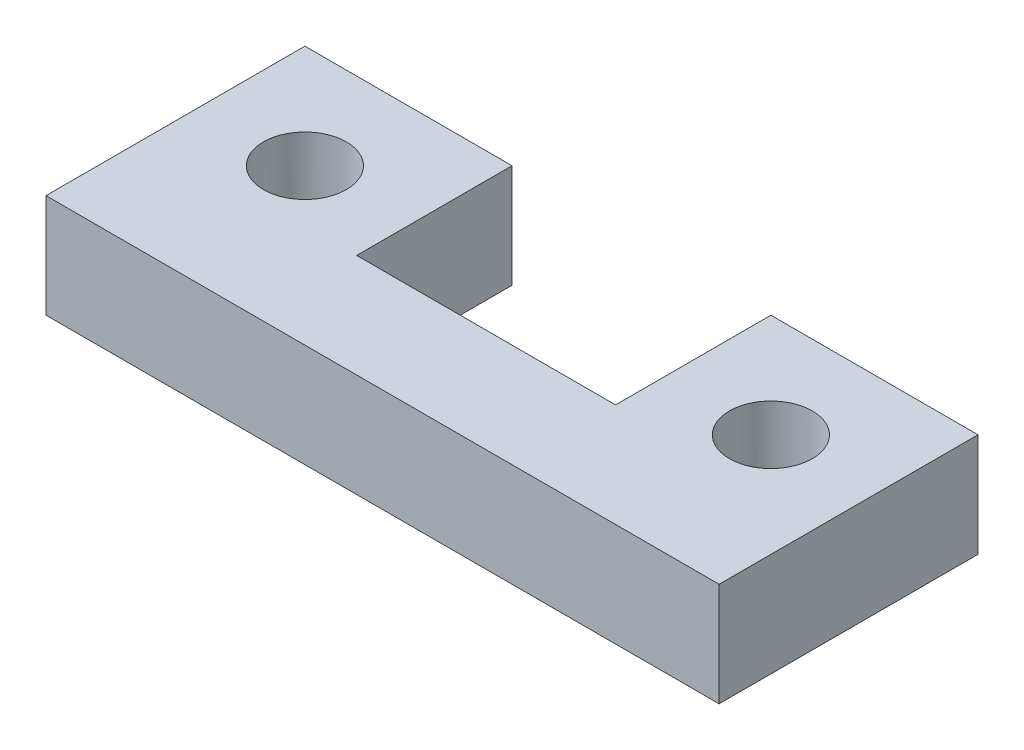
ISO-10303-21;
HEADER;
FILE_DESCRIPTION(('STEP AP214'),'2;1');
FILE_NAME('part.step','',(''),(''),'','','');
FILE_SCHEMA(('AUTOMOTIVE_DESIGN { 1 0 10303 214 1 1 1 1 }'));
ENDSEC;
DATA;
#1=APPLICATION_CONTEXT('core data for automotive mechanical design processes');
#2=APPLICATION_PROTOCOL_DEFINITION('international standard','automotive_design',2000,#1);
#3=PRODUCT_CONTEXT('',#1,'mechanical');
#4=PRODUCT('Part','Part','',(#3));
#5=PRODUCT_RELATED_PRODUCT_CATEGORY('part','',(#4));
#6=PRODUCT_DEFINITION_FORMATION('','',#4);
#7=PRODUCT_DEFINITION_CONTEXT('part definition',#1,'design');
#8=PRODUCT_DEFINITION('design','',#6,#7);
#9=PRODUCT_DEFINITION_SHAPE('','',#8);
#10=(LENGTH_UNIT() NAMED_UNIT(*) SI_UNIT(.MILLI.,.METRE.));
#11=(NAMED_UNIT(*) PLANE_ANGLE_UNIT() SI_UNIT($,.RADIAN.));
#12=(NAMED_UNIT(*) SI_UNIT($,.STERADIAN.) SOLID_ANGLE_UNIT());
#13=UNCERTAINTY_MEASURE_WITH_UNIT(LENGTH_MEASURE(1.E-05),#10,'distance_accuracy_value','');
#14=(GEOMETRIC_REPRESENTATION_CONTEXT(3) GLOBAL_UNCERTAINTY_ASSIGNED_CONTEXT((#13)) GLOBAL_UNIT_ASSIGNED_CONTEXT((#10,
#11,#12)) REPRESENTATION_CONTEXT('',''));
#15=CARTESIAN_POINT('',(0.,0.,0.));
#16=DIRECTION('',(0.,0.,1.));
#17=DIRECTION('',(1.,0.,0.));
#18=AXIS2_PLACEMENT_3D('',#15,#16,#17);
#19=CARTESIAN_POINT('',(-12.5,5.,-9.99999999999999));
#20=DIRECTION('',(0.,0.,1.));
#21=DIRECTION('',(1.,0.,0.));
#22=AXIS2_PLACEMENT_3D('',#19,#20,#21);
#23=PLANE('',#22);
#24=DIRECTION('',(-1.,0.,0.));
#25=VECTOR('',#24,1.);
#26=CARTESIAN_POINT('',(-12.5,-5.,-9.99999999999999));
#27=LINE('',#26,#25);
#28=CARTESIAN_POINT('',(12.5,-5.,-9.99999999999999));
#29=VERTEX_POINT('',#28);
#30=CARTESIAN_POINT('',(-12.5,-5.,-9.99999999999999));
#31=VERTEX_POINT('',#30);
#32=EDGE_CURVE('E140',#29,#31,#27,.T.);
#33=ORIENTED_EDGE('',*,*,#32,.T.);
#34=DIRECTION('',(0.,-1.,0.));
#35=VECTOR('',#34,1.);
#36=CARTESIAN_POINT('',(-12.5,5.,-9.99999999999999));
#37=LINE('',#36,#35);
#38=CARTESIAN_POINT('',(-12.5,5.,-9.99999999999999));
#39=VERTEX_POINT('',#38);
#40=EDGE_CURVE('E11',#39,#31,#37,.T.);
#41=ORIENTED_EDGE('',*,*,#40,.F.);
#42=DIRECTION('',(-1.,0.,0.));
#43=VECTOR('',#42,1.);
#44=CARTESIAN_POINT('',(-12.5,5.,-9.99999999999999));
#45=LINE('',#44,#43);
#46=CARTESIAN_POINT('',(12.5,5.,-9.99999999999999));
#47=VERTEX_POINT('',#46);
#48=EDGE_CURVE('E163',#47,#39,#45,.T.);
#49=ORIENTED_EDGE('',*,*,#48,.F.);
#50=DIRECTION('',(0.,-1.,0.));
#51=VECTOR('',#50,1.);
#52=CARTESIAN_POINT('',(12.5,5.,-9.99999999999999));
#53=LINE('',#52,#51);
#54=EDGE_CURVE('E136',#47,#29,#53,.T.);
#55=ORIENTED_EDGE('',*,*,#54,.T.);
#56=EDGE_LOOP('',(#33,#41,#49,#55));
#57=FACE_BOUND('',#56,.T.);
#58=ADVANCED_FACE('F39',(#57),#23,.F.);
#59=CARTESIAN_POINT('',(-12.5,5.,-25.));
#60=DIRECTION('',(-1.,0.,0.));
#61=DIRECTION('',(0.,0.,1.));
#62=AXIS2_PLACEMENT_3D('',#59,#60,#61);
#63=PLANE('',#62);
#64=DIRECTION('',(0.,0.,-1.));
#65=VECTOR('',#64,1.);
#66=CARTESIAN_POINT('',(-12.5,-5.,-25.));
#67=LINE('',#66,#65);
#68=CARTESIAN_POINT('',(-12.5,-5.,-25.));
#69=VERTEX_POINT('',#68);
#70=EDGE_CURVE('E144',#31,#69,#67,.T.);
#71=ORIENTED_EDGE('',*,*,#70,.T.);
#72=DIRECTION('',(0.,-1.,0.));
#73=VECTOR('',#72,1.);
#74=CARTESIAN_POINT('',(-12.5,5.,-25.));
#75=LINE('',#74,#73);
#76=CARTESIAN_POINT('',(-12.5,5.,-25.));
#77=VERTEX_POINT('',#76);
#78=EDGE_CURVE('E48',#77,#69,#75,.T.);
#79=ORIENTED_EDGE('',*,*,#78,.F.);
#80=DIRECTION('',(0.,0.,-1.));
#81=VECTOR('',#80,1.);
#82=CARTESIAN_POINT('',(-12.5,5.,-25.));
#83=LINE('',#82,#81);
#84=EDGE_CURVE('E99',#39,#77,#83,.T.);
#85=ORIENTED_EDGE('',*,*,#84,.F.);
#86=ORIENTED_EDGE('',*,*,#40,.T.);
#87=EDGE_LOOP('',(#71,#79,#85,#86));
#88=FACE_BOUND('',#87,.T.);
#89=ADVANCED_FACE('F247',(#88),#63,.F.);
#90=CARTESIAN_POINT('',(-32.5,5.,-25.));
#91=DIRECTION('',(0.,0.,1.));
#92=DIRECTION('',(1.,0.,0.));
#93=AXIS2_PLACEMENT_3D('',#90,#91,#92);
#94=PLANE('',#93);
#95=DIRECTION('',(-1.,0.,0.));
#96=VECTOR('',#95,1.);
#97=CARTESIAN_POINT('',(-32.5,-5.,-25.));
#98=LINE('',#97,#96);
#99=CARTESIAN_POINT('',(-32.5,-5.,-25.));
#100=VERTEX_POINT('',#99);
#101=EDGE_CURVE('E148',#69,#100,#98,.T.);
#102=ORIENTED_EDGE('',*,*,#101,.T.);
#103=DIRECTION('',(0.,-1.,0.));
#104=VECTOR('',#103,1.);
#105=CARTESIAN_POINT('',(-32.5,5.,-25.));
#106=LINE('',#105,#104);
#107=CARTESIAN_POINT('',(-32.5,5.,-25.));
#108=VERTEX_POINT('',#107);
#109=EDGE_CURVE('E174',#108,#100,#106,.T.);
#110=ORIENTED_EDGE('',*,*,#109,.F.);
#111=DIRECTION('',(-1.,0.,0.));
#112=VECTOR('',#111,1.);
#113=CARTESIAN_POINT('',(-32.5,5.,-25.));
#114=LINE('',#113,#112);
#115=EDGE_CURVE('E184',#77,#108,#114,.T.);
#116=ORIENTED_EDGE('',*,*,#115,.F.);
#117=ORIENTED_EDGE('',*,*,#78,.T.);
#118=EDGE_LOOP('',(#102,#110,#116,#117));
#119=FACE_BOUND('',#118,.T.);
#120=ADVANCED_FACE('F182',(#119),#94,.F.);
#121=CARTESIAN_POINT('',(-32.5,5.,0.));
#122=DIRECTION('',(1.,0.,0.));
#123=DIRECTION('',(0.,0.,-1.));
#124=AXIS2_PLACEMENT_3D('',#121,#122,#123);
#125=PLANE('',#124);
#126=DIRECTION('',(0.,0.,1.));
#127=VECTOR('',#126,1.);
#128=CARTESIAN_POINT('',(-32.5,-5.,0.));
#129=LINE('',#128,#127);
#130=CARTESIAN_POINT('',(-32.5,-5.,0.));
#131=VERTEX_POINT('',#130);
#132=EDGE_CURVE('E151',#100,#131,#129,.T.);
#133=ORIENTED_EDGE('',*,*,#132,.T.);
#134=DIRECTION('',(0.,-1.,0.));
#135=VECTOR('',#134,1.);
#136=CARTESIAN_POINT('',(-32.5,5.,0.));
#137=LINE('',#136,#135);
#138=CARTESIAN_POINT('',(-32.5,5.,0.));
#139=VERTEX_POINT('',#138);
#140=EDGE_CURVE('E170',#139,#131,#137,.T.);
#141=ORIENTED_EDGE('',*,*,#140,.F.);
#142=DIRECTION('',(0.,0.,1.));
#143=VECTOR('',#142,1.);
#144=CARTESIAN_POINT('',(-32.5,5.,0.));
#145=LINE('',#144,#143);
#146=EDGE_CURVE('E197',#108,#139,#145,.T.);
#147=ORIENTED_EDGE('',*,*,#146,.F.);
#148=ORIENTED_EDGE('',*,*,#109,.T.);
#149=EDGE_LOOP('',(#133,#141,#147,#148));
#150=FACE_BOUND('',#149,.T.);
#151=ADVANCED_FACE('F192',(#150),#125,.F.);
#152=CARTESIAN_POINT('',(32.5,5.,0.));
#153=DIRECTION('',(0.,0.,-1.));
#154=DIRECTION('',(-1.,0.,0.));
#155=AXIS2_PLACEMENT_3D('',#152,#153,#154);
#156=PLANE('',#155);
#157=DIRECTION('',(1.,0.,0.));
#158=VECTOR('',#157,1.);
#159=CARTESIAN_POINT('',(32.5,-5.,0.));
#160=LINE('',#159,#158);
#161=CARTESIAN_POINT('',(32.5,-5.,0.));
#162=VERTEX_POINT('',#161);
#163=EDGE_CURVE('E154',#131,#162,#160,.T.);
#164=ORIENTED_EDGE('',*,*,#163,.T.);
#165=DIRECTION('',(0.,-1.,0.));
#166=VECTOR('',#165,1.);
#167=CARTESIAN_POINT('',(32.5,5.,0.));
#168=LINE('',#167,#166);
#169=CARTESIAN_POINT('',(32.5,5.,0.));
#170=VERTEX_POINT('',#169);
#171=EDGE_CURVE('E129',#170,#162,#168,.T.);
#172=ORIENTED_EDGE('',*,*,#171,.F.);
#173=DIRECTION('',(1.,0.,0.));
#174=VECTOR('',#173,1.);
#175=CARTESIAN_POINT('',(32.5,5.,0.));
#176=LINE('',#175,#174);
#177=EDGE_CURVE('E118',#139,#170,#176,.T.);
#178=ORIENTED_EDGE('',*,*,#177,.F.);
#179=ORIENTED_EDGE('',*,*,#140,.T.);
#180=EDGE_LOOP('',(#164,#172,#178,#179));
#181=FACE_BOUND('',#180,.T.);
#182=ADVANCED_FACE('F195',(#181),#156,.F.);
#183=CARTESIAN_POINT('',(32.5,5.,0.));
#184=DIRECTION('',(-1.,0.,0.));
#185=DIRECTION('',(0.,0.,1.));
#186=AXIS2_PLACEMENT_3D('',#183,#184,#185);
#187=PLANE('',#186);
#188=DIRECTION('',(0.,0.,-1.));
#189=VECTOR('',#188,1.);
#190=CARTESIAN_POINT('',(32.5,-5.,0.));
#191=LINE('',#190,#189);
#192=CARTESIAN_POINT('',(32.5,-5.,-25.));
#193=VERTEX_POINT('',#192);
#194=EDGE_CURVE('E127',#162,#193,#191,.T.);
#195=ORIENTED_EDGE('',*,*,#194,.T.);
#196=DIRECTION('',(0.,-1.,0.));
#197=VECTOR('',#196,1.);
#198=CARTESIAN_POINT('',(32.5,5.,-25.));
#199=LINE('',#198,#197);
#200=CARTESIAN_POINT('',(32.5,5.,-25.));
#201=VERTEX_POINT('',#200);
#202=EDGE_CURVE('E124',#201,#193,#199,.T.);
#203=ORIENTED_EDGE('',*,*,#202,.F.);
#204=DIRECTION('',(0.,0.,-1.));
#205=VECTOR('',#204,1.);
#206=CARTESIAN_POINT('',(32.5,5.,0.));
#207=LINE('',#206,#205);
#208=EDGE_CURVE('E112',#170,#201,#207,.T.);
#209=ORIENTED_EDGE('',*,*,#208,.F.);
#210=ORIENTED_EDGE('',*,*,#171,.T.);
#211=EDGE_LOOP('',(#195,#203,#209,#210));
#212=FACE_BOUND('',#211,.T.);
#213=ADVANCED_FACE('F125',(#212),#187,.F.);
#214=CARTESIAN_POINT('',(32.5,5.,-25.));
#215=DIRECTION('',(0.,0.,1.));
#216=DIRECTION('',(1.,0.,0.));
#217=AXIS2_PLACEMENT_3D('',#214,#215,#216);
#218=PLANE('',#217);
#219=DIRECTION('',(-1.,0.,0.));
#220=VECTOR('',#219,1.);
#221=CARTESIAN_POINT('',(32.5,-5.,-25.));
#222=LINE('',#221,#220);
#223=CARTESIAN_POINT('',(12.5,-5.,-25.));
#224=VERTEX_POINT('',#223);
#225=EDGE_CURVE('E85',#193,#224,#222,.T.);
#226=ORIENTED_EDGE('',*,*,#225,.T.);
#227=DIRECTION('',(0.,-1.,0.));
#228=VECTOR('',#227,1.);
#229=CARTESIAN_POINT('',(12.5,5.,-25.));
#230=LINE('',#229,#228);
#231=CARTESIAN_POINT('',(12.5,5.,-25.));
#232=VERTEX_POINT('',#231);
#233=EDGE_CURVE('E130',#232,#224,#230,.T.);
#234=ORIENTED_EDGE('',*,*,#233,.F.);
#235=DIRECTION('',(-1.,0.,0.));
#236=VECTOR('',#235,1.);
#237=CARTESIAN_POINT('',(32.5,5.,-25.));
#238=LINE('',#237,#236);
#239=EDGE_CURVE('E116',#201,#232,#238,.T.);
#240=ORIENTED_EDGE('',*,*,#239,.F.);
#241=ORIENTED_EDGE('',*,*,#202,.T.);
#242=EDGE_LOOP('',(#226,#234,#240,#241));
#243=FACE_BOUND('',#242,.T.);
#244=ADVANCED_FACE('F132',(#243),#218,.F.);
#245=CARTESIAN_POINT('',(12.5,5.,-25.));
#246=DIRECTION('',(1.,0.,0.));
#247=DIRECTION('',(0.,0.,-1.));
#248=AXIS2_PLACEMENT_3D('',#245,#246,#247);
#249=PLANE('',#248);
#250=DIRECTION('',(0.,0.,1.));
#251=VECTOR('',#250,1.);
#252=CARTESIAN_POINT('',(12.5,-5.,-25.));
#253=LINE('',#252,#251);
#254=EDGE_CURVE('E91',#224,#29,#253,.T.);
#255=ORIENTED_EDGE('',*,*,#254,.T.);
#256=ORIENTED_EDGE('',*,*,#54,.F.);
#257=DIRECTION('',(0.,0.,1.));
#258=VECTOR('',#257,1.);
#259=CARTESIAN_POINT('',(12.5,5.,-25.));
#260=LINE('',#259,#258);
#261=EDGE_CURVE('E56',#232,#47,#260,.T.);
#262=ORIENTED_EDGE('',*,*,#261,.F.);
#263=ORIENTED_EDGE('',*,*,#233,.T.);
#264=EDGE_LOOP('',(#255,#256,#262,#263));
#265=FACE_BOUND('',#264,.T.);
#266=ADVANCED_FACE('F238',(#265),#249,.F.);
#267=CARTESIAN_POINT('',(0.,5.,0.));
#268=DIRECTION('',(0.,-1.,0.));
#269=DIRECTION('',(0.,0.,-1.));
#270=AXIS2_PLACEMENT_3D('',#267,#268,#269);
#271=PLANE('',#270);
#272=CARTESIAN_POINT('',(22.5,5.,-15.));
#273=DIRECTION('',(0.,-1.,0.));
#274=DIRECTION('',(0.,0.,-1.));
#275=AXIS2_PLACEMENT_3D('',#272,#273,#274);
#276=CIRCLE('',#275,4.);
#277=CARTESIAN_POINT('',(22.5,5.,-19.));
#278=VERTEX_POINT('',#277);
#279=EDGE_CURVE('E214',#278,#278,#276,.F.);
#280=ORIENTED_EDGE('',*,*,#279,.F.);
#281=EDGE_LOOP('',(#280));
#282=FACE_BOUND('',#281,.T.);
#283=CARTESIAN_POINT('',(-22.5,5.,-15.));
#284=DIRECTION('',(0.,-1.,0.));
#285=DIRECTION('',(0.,0.,-1.));
#286=AXIS2_PLACEMENT_3D('',#283,#284,#285);
#287=CIRCLE('',#286,4.);
#288=CARTESIAN_POINT('',(-22.5,5.,-19.));
#289=VERTEX_POINT('',#288);
#290=EDGE_CURVE('E145',#289,#289,#287,.T.);
#291=ORIENTED_EDGE('',*,*,#290,.T.);
#292=EDGE_LOOP('',(#291));
#293=FACE_BOUND('',#292,.T.);
#294=ORIENTED_EDGE('',*,*,#48,.T.);
#295=ORIENTED_EDGE('',*,*,#84,.T.);
#296=ORIENTED_EDGE('',*,*,#115,.T.);
#297=ORIENTED_EDGE('',*,*,#146,.T.);
#298=ORIENTED_EDGE('',*,*,#177,.T.);
#299=ORIENTED_EDGE('',*,*,#208,.T.);
#300=ORIENTED_EDGE('',*,*,#239,.T.);
#301=ORIENTED_EDGE('',*,*,#261,.T.);
#302=EDGE_LOOP('',(#294,#295,#296,#297,#298,#299,#300,#301));
#303=FACE_BOUND('',#302,.T.);
#304=ADVANCED_FACE('F114',(#282,#293,#303),#271,.F.);
#305=CARTESIAN_POINT('',(0.,-5.,0.));
#306=DIRECTION('',(0.,-1.,0.));
#307=DIRECTION('',(0.,0.,-1.));
#308=AXIS2_PLACEMENT_3D('',#305,#306,#307);
#309=PLANE('',#308);
#310=CARTESIAN_POINT('',(22.5,-5.,-15.));
#311=DIRECTION('',(0.,-1.,0.));
#312=DIRECTION('',(0.,0.,1.));
#313=AXIS2_PLACEMENT_3D('',#310,#311,#312);
#314=CIRCLE('',#313,4.);
#315=CARTESIAN_POINT('',(22.5,-5.,-11.));
#316=VERTEX_POINT('',#315);
#317=EDGE_CURVE('E218',#316,#316,#314,.T.);
#318=ORIENTED_EDGE('',*,*,#317,.F.);
#319=EDGE_LOOP('',(#318));
#320=FACE_BOUND('',#319,.T.);
#321=CARTESIAN_POINT('',(-22.5,-5.,-15.));
#322=DIRECTION('',(0.,1.,0.));
#323=DIRECTION('',(0.,0.,1.));
#324=AXIS2_PLACEMENT_3D('',#321,#322,#323);
#325=CIRCLE('',#324,4.);
#326=CARTESIAN_POINT('',(-22.5,-5.,-11.));
#327=VERTEX_POINT('',#326);
#328=EDGE_CURVE('E210',#327,#327,#325,.T.);
#329=ORIENTED_EDGE('',*,*,#328,.T.);
#330=EDGE_LOOP('',(#329));
#331=FACE_BOUND('',#330,.T.);
#332=ORIENTED_EDGE('',*,*,#32,.F.);
#333=ORIENTED_EDGE('',*,*,#254,.F.);
#334=ORIENTED_EDGE('',*,*,#225,.F.);
#335=ORIENTED_EDGE('',*,*,#194,.F.);
#336=ORIENTED_EDGE('',*,*,#163,.F.);
#337=ORIENTED_EDGE('',*,*,#132,.F.);
#338=ORIENTED_EDGE('',*,*,#101,.F.);
#339=ORIENTED_EDGE('',*,*,#70,.F.);
#340=EDGE_LOOP('',(#332,#333,#334,#335,#336,#337,#338,#339));
#341=FACE_BOUND('',#340,.T.);
#342=ADVANCED_FACE('F188',(#320,#331,#341),#309,.T.);
#343=CARTESIAN_POINT('',(-22.5,-5.,-15.));
#344=DIRECTION('',(0.,1.,0.));
#345=DIRECTION('',(0.,0.,1.));
#346=AXIS2_PLACEMENT_3D('',#343,#344,#345);
#347=CYLINDRICAL_SURFACE('',#346,4.);
#348=ORIENTED_EDGE('',*,*,#328,.F.);
#349=EDGE_LOOP('',(#348));
#350=FACE_BOUND('',#349,.T.);
#351=ORIENTED_EDGE('',*,*,#290,.F.);
#352=EDGE_LOOP('',(#351));
#353=FACE_BOUND('',#352,.T.);
#354=ADVANCED_FACE('F228',(#350,#353),#347,.F.);
#355=CARTESIAN_POINT('',(22.5,-5.,-15.));
#356=DIRECTION('',(0.,1.,0.));
#357=DIRECTION('',(0.,0.,1.));
#358=AXIS2_PLACEMENT_3D('',#355,#356,#357);
#359=CYLINDRICAL_SURFACE('',#358,4.);
#360=ORIENTED_EDGE('',*,*,#317,.T.);
#361=EDGE_LOOP('',(#360));
#362=FACE_BOUND('',#361,.T.);
#363=ORIENTED_EDGE('',*,*,#279,.T.);
#364=EDGE_LOOP('',(#363));
#365=FACE_BOUND('',#364,.T.);
#366=ADVANCED_FACE('F223',(#362,#365),#359,.F.);
#367=CLOSED_SHELL('',(#58,#89,#120,#151,#182,#213,#244,#266,#304,#342,#354,#366));
#368=MANIFOLD_SOLID_BREP('B2',#367);
#369=ADVANCED_BREP_SHAPE_REPRESENTATION('',(#18,#368),#14);
#370=SHAPE_DEFINITION_REPRESENTATION(#9,#369);
ENDSEC;
END-ISO-10303-21;
